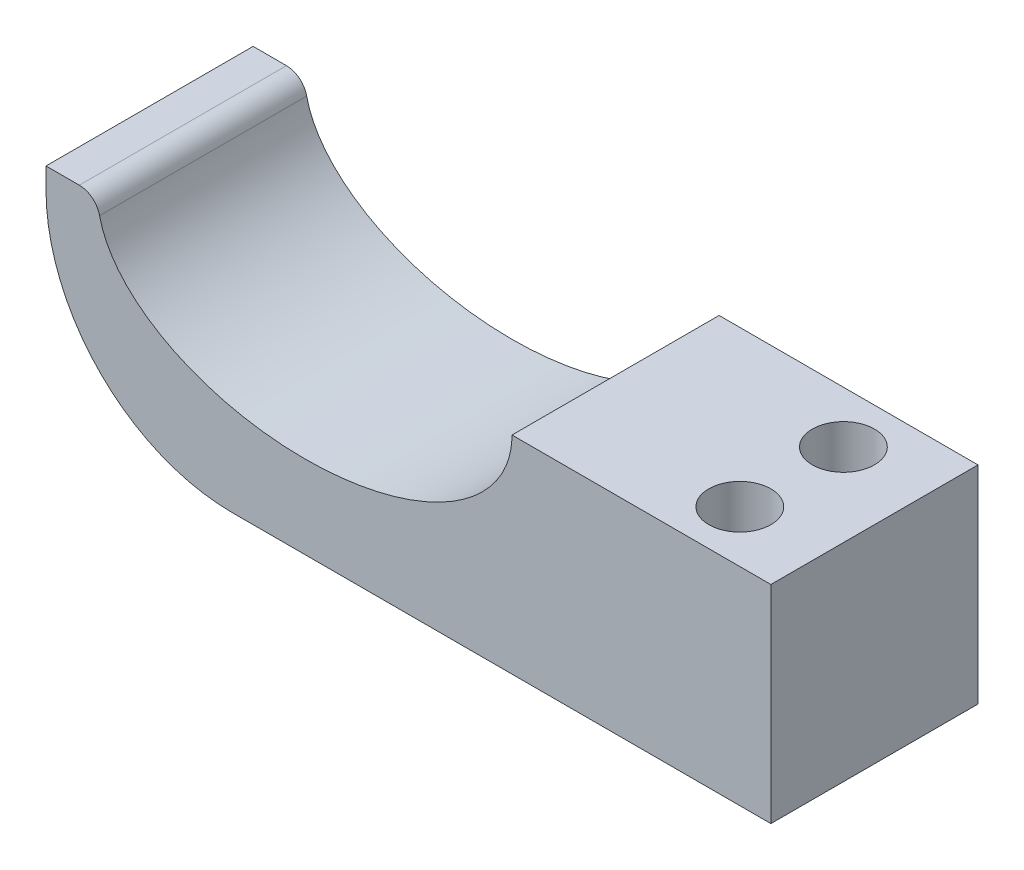
ISO-10303-21;
HEADER;
FILE_DESCRIPTION(('STEP AP214'),'2;1');
FILE_NAME('part.step','',(''),(''),'','','');
FILE_SCHEMA(('AUTOMOTIVE_DESIGN { 1 0 10303 214 1 1 1 1 }'));
ENDSEC;
DATA;
#1=APPLICATION_CONTEXT('core data for automotive mechanical design processes');
#2=APPLICATION_PROTOCOL_DEFINITION('international standard','automotive_design',2000,#1);
#3=PRODUCT_CONTEXT('',#1,'mechanical');
#4=PRODUCT('Part','Part','',(#3));
#5=PRODUCT_RELATED_PRODUCT_CATEGORY('part','',(#4));
#6=PRODUCT_DEFINITION_FORMATION('','',#4);
#7=PRODUCT_DEFINITION_CONTEXT('part definition',#1,'design');
#8=PRODUCT_DEFINITION('design','',#6,#7);
#9=PRODUCT_DEFINITION_SHAPE('','',#8);
#10=(LENGTH_UNIT() NAMED_UNIT(*) SI_UNIT(.MILLI.,.METRE.));
#11=(NAMED_UNIT(*) PLANE_ANGLE_UNIT() SI_UNIT($,.RADIAN.));
#12=(NAMED_UNIT(*) SI_UNIT($,.STERADIAN.) SOLID_ANGLE_UNIT());
#13=UNCERTAINTY_MEASURE_WITH_UNIT(LENGTH_MEASURE(1.E-05),#10,'distance_accuracy_value','');
#14=(GEOMETRIC_REPRESENTATION_CONTEXT(3) GLOBAL_UNCERTAINTY_ASSIGNED_CONTEXT((#13)) GLOBAL_UNIT_ASSIGNED_CONTEXT((#10,
#11,#12)) REPRESENTATION_CONTEXT('',''));
#15=CARTESIAN_POINT('',(0.,0.,0.));
#16=DIRECTION('',(0.,0.,1.));
#17=DIRECTION('',(1.,0.,0.));
#18=AXIS2_PLACEMENT_3D('',#15,#16,#17);
#19=CARTESIAN_POINT('',(0.,25.4,0.));
#20=DIRECTION('',(0.,1.,0.));
#21=DIRECTION('',(0.,0.,1.));
#22=AXIS2_PLACEMENT_3D('',#19,#20,#21);
#23=PLANE('',#22);
#24=DIRECTION('',(1.,0.,0.));
#25=VECTOR('',#24,1.);
#26=CARTESIAN_POINT('',(-44.45,25.4,12.7));
#27=LINE('',#26,#25);
#28=CARTESIAN_POINT('',(-44.45,25.4,12.7));
#29=VERTEX_POINT('',#28);
#30=CARTESIAN_POINT('',(-40.362270899556,25.4,12.7));
#31=VERTEX_POINT('',#30);
#32=EDGE_CURVE('E136',#29,#31,#27,.T.);
#33=ORIENTED_EDGE('',*,*,#32,.T.);
#34=DIRECTION('',(0.,0.,-1.));
#35=VECTOR('',#34,1.);
#36=CARTESIAN_POINT('',(-40.362270899556,25.4,-12.7));
#37=LINE('',#36,#35);
#38=CARTESIAN_POINT('',(-40.362270899556,25.4,-12.7));
#39=VERTEX_POINT('',#38);
#40=EDGE_CURVE('E157',#31,#39,#37,.T.);
#41=ORIENTED_EDGE('',*,*,#40,.T.);
#42=DIRECTION('',(-1.,0.,0.));
#43=VECTOR('',#42,1.);
#44=CARTESIAN_POINT('',(-44.45,25.4,-12.7));
#45=LINE('',#44,#43);
#46=CARTESIAN_POINT('',(-44.45,25.4,-12.7));
#47=VERTEX_POINT('',#46);
#48=EDGE_CURVE('E129',#39,#47,#45,.T.);
#49=ORIENTED_EDGE('',*,*,#48,.T.);
#50=DIRECTION('',(0.,0.,1.));
#51=VECTOR('',#50,1.);
#52=CARTESIAN_POINT('',(-44.45,25.4,-12.7));
#53=LINE('',#52,#51);
#54=EDGE_CURVE('E128',#47,#29,#53,.T.);
#55=ORIENTED_EDGE('',*,*,#54,.T.);
#56=EDGE_LOOP('',(#33,#41,#49,#55));
#57=FACE_BOUND('',#56,.T.);
#58=ADVANCED_FACE('F37',(#57),#23,.T.);
#59=CARTESIAN_POINT('',(44.45,25.4,-12.7));
#60=DIRECTION('',(-1.,0.,0.));
#61=DIRECTION('',(0.,0.,1.));
#62=AXIS2_PLACEMENT_3D('',#59,#60,#61);
#63=PLANE('',#62);
#64=DIRECTION('',(0.,0.,-1.));
#65=VECTOR('',#64,1.);
#66=CARTESIAN_POINT('',(44.45,0.,-12.7));
#67=LINE('',#66,#65);
#68=CARTESIAN_POINT('',(44.45,0.,12.7));
#69=VERTEX_POINT('',#68);
#70=CARTESIAN_POINT('',(44.45,0.,-12.7));
#71=VERTEX_POINT('',#70);
#72=EDGE_CURVE('E112',#69,#71,#67,.T.);
#73=ORIENTED_EDGE('',*,*,#72,.T.);
#74=DIRECTION('',(0.,-1.,0.));
#75=VECTOR('',#74,1.);
#76=CARTESIAN_POINT('',(44.45,25.4,-12.7));
#77=LINE('',#76,#75);
#78=CARTESIAN_POINT('',(44.45,25.4,-12.7));
#79=VERTEX_POINT('',#78);
#80=EDGE_CURVE('E122',#79,#71,#77,.T.);
#81=ORIENTED_EDGE('',*,*,#80,.F.);
#82=DIRECTION('',(0.,0.,-1.));
#83=VECTOR('',#82,1.);
#84=CARTESIAN_POINT('',(44.45,25.4,-12.7));
#85=LINE('',#84,#83);
#86=CARTESIAN_POINT('',(44.45,25.4,12.7));
#87=VERTEX_POINT('',#86);
#88=EDGE_CURVE('E126',#87,#79,#85,.T.);
#89=ORIENTED_EDGE('',*,*,#88,.F.);
#90=DIRECTION('',(0.,-1.,0.));
#91=VECTOR('',#90,1.);
#92=CARTESIAN_POINT('',(44.45,25.4,12.7));
#93=LINE('',#92,#91);
#94=EDGE_CURVE('E139',#87,#69,#93,.T.);
#95=ORIENTED_EDGE('',*,*,#94,.T.);
#96=EDGE_LOOP('',(#73,#81,#89,#95));
#97=FACE_BOUND('',#96,.T.);
#98=ADVANCED_FACE('F205',(#97),#63,.F.);
#99=CARTESIAN_POINT('',(-44.45,25.4,-12.7));
#100=DIRECTION('',(0.,0.,1.));
#101=DIRECTION('',(1.,0.,0.));
#102=AXIS2_PLACEMENT_3D('',#99,#100,#101);
#103=PLANE('',#102);
#104=DIRECTION('',(-1.,0.,0.));
#105=VECTOR('',#104,1.);
#106=CARTESIAN_POINT('',(-44.45,0.,-12.7));
#107=LINE('',#106,#105);
#108=CARTESIAN_POINT('',(-21.59,0.,-12.7));
#109=VERTEX_POINT('',#108);
#110=EDGE_CURVE('E142',#71,#109,#107,.T.);
#111=ORIENTED_EDGE('',*,*,#110,.T.);
#112=CARTESIAN_POINT('',(-21.59,22.86,-12.7));
#113=DIRECTION('',(0.,0.,1.));
#114=DIRECTION('',(1.,0.,0.));
#115=AXIS2_PLACEMENT_3D('',#112,#113,#114);
#116=CIRCLE('',#115,22.86);
#117=CARTESIAN_POINT('',(-44.45,22.86,-12.7));
#118=VERTEX_POINT('',#117);
#119=EDGE_CURVE('E11',#109,#118,#116,.F.);
#120=ORIENTED_EDGE('',*,*,#119,.T.);
#121=DIRECTION('',(0.,-1.,0.));
#122=VECTOR('',#121,1.);
#123=CARTESIAN_POINT('',(-44.45,25.4,-12.7));
#124=LINE('',#123,#122);
#125=EDGE_CURVE('E150',#47,#118,#124,.T.);
#126=ORIENTED_EDGE('',*,*,#125,.F.);
#127=ORIENTED_EDGE('',*,*,#48,.F.);
#128=CARTESIAN_POINT('',(-40.362270899556,22.86,-12.7));
#129=DIRECTION('',(0.,0.,1.));
#130=DIRECTION('',(1.,0.,0.));
#131=AXIS2_PLACEMENT_3D('',#128,#129,#130);
#132=CIRCLE('',#131,2.54);
#133=CARTESIAN_POINT('',(-37.8815880027146,23.4057218754259,-12.7));
#134=VERTEX_POINT('',#133);
#135=EDGE_CURVE('E108',#39,#134,#132,.F.);
#136=ORIENTED_EDGE('',*,*,#135,.T.);
#137=CARTESIAN_POINT('',(-12.7,25.4,-12.7));
#138=DIRECTION('',(0.,0.,1.));
#139=DIRECTION('',(-1.,0.,0.));
#140=AXIS2_PLACEMENT_3D('',#137,#138,#139);
#141=ELLIPSE('',#140,25.4,15.24);
#142=CARTESIAN_POINT('',(12.7,25.4,-12.7));
#143=VERTEX_POINT('',#142);
#144=EDGE_CURVE('E99',#134,#143,#141,.T.);
#145=ORIENTED_EDGE('',*,*,#144,.T.);
#146=EDGE_CURVE('E104',#79,#143,#45,.T.);
#147=ORIENTED_EDGE('',*,*,#146,.F.);
#148=ORIENTED_EDGE('',*,*,#80,.T.);
#149=EDGE_LOOP('',(#111,#120,#126,#127,#136,#145,#147,#148));
#150=FACE_BOUND('',#149,.T.);
#151=ADVANCED_FACE('F101',(#150),#103,.F.);
#152=CARTESIAN_POINT('',(-44.45,25.4,-12.7));
#153=DIRECTION('',(1.,0.,0.));
#154=DIRECTION('',(0.,0.,-1.));
#155=AXIS2_PLACEMENT_3D('',#152,#153,#154);
#156=PLANE('',#155);
#157=ORIENTED_EDGE('',*,*,#125,.T.);
#158=DIRECTION('',(0.,0.,1.));
#159=VECTOR('',#158,1.);
#160=CARTESIAN_POINT('',(-44.45,22.86,-12.7));
#161=LINE('',#160,#159);
#162=CARTESIAN_POINT('',(-44.45,22.86,12.7));
#163=VERTEX_POINT('',#162);
#164=EDGE_CURVE('E160',#118,#163,#161,.T.);
#165=ORIENTED_EDGE('',*,*,#164,.T.);
#166=DIRECTION('',(0.,-1.,0.));
#167=VECTOR('',#166,1.);
#168=CARTESIAN_POINT('',(-44.45,25.4,12.7));
#169=LINE('',#168,#167);
#170=EDGE_CURVE('E148',#29,#163,#169,.T.);
#171=ORIENTED_EDGE('',*,*,#170,.F.);
#172=ORIENTED_EDGE('',*,*,#54,.F.);
#173=EDGE_LOOP('',(#157,#165,#171,#172));
#174=FACE_BOUND('',#173,.T.);
#175=ADVANCED_FACE('F166',(#174),#156,.F.);
#176=CARTESIAN_POINT('',(-44.45,25.4,12.7));
#177=DIRECTION('',(0.,0.,-1.));
#178=DIRECTION('',(-1.,0.,0.));
#179=AXIS2_PLACEMENT_3D('',#176,#177,#178);
#180=PLANE('',#179);
#181=ORIENTED_EDGE('',*,*,#170,.T.);
#182=CARTESIAN_POINT('',(-21.59,22.86,12.7));
#183=DIRECTION('',(0.,0.,-1.));
#184=DIRECTION('',(-1.,0.,0.));
#185=AXIS2_PLACEMENT_3D('',#182,#183,#184);
#186=CIRCLE('',#185,22.86);
#187=CARTESIAN_POINT('',(-21.59,0.,12.7));
#188=VERTEX_POINT('',#187);
#189=EDGE_CURVE('E59',#163,#188,#186,.F.);
#190=ORIENTED_EDGE('',*,*,#189,.T.);
#191=DIRECTION('',(1.,0.,0.));
#192=VECTOR('',#191,1.);
#193=CARTESIAN_POINT('',(-44.45,0.,12.7));
#194=LINE('',#193,#192);
#195=EDGE_CURVE('E144',#188,#69,#194,.T.);
#196=ORIENTED_EDGE('',*,*,#195,.T.);
#197=ORIENTED_EDGE('',*,*,#94,.F.);
#198=CARTESIAN_POINT('',(12.7,25.4,12.7));
#199=VERTEX_POINT('',#198);
#200=EDGE_CURVE('E131',#199,#87,#27,.T.);
#201=ORIENTED_EDGE('',*,*,#200,.F.);
#202=CARTESIAN_POINT('',(-12.7,25.4,12.7));
#203=DIRECTION('',(0.,0.,1.));
#204=DIRECTION('',(-1.,0.,0.));
#205=AXIS2_PLACEMENT_3D('',#202,#203,#204);
#206=ELLIPSE('',#205,25.4,15.24);
#207=CARTESIAN_POINT('',(-37.8815880027146,23.4057218754259,12.7));
#208=VERTEX_POINT('',#207);
#209=EDGE_CURVE('E113',#208,#199,#206,.T.);
#210=ORIENTED_EDGE('',*,*,#209,.F.);
#211=CARTESIAN_POINT('',(-40.362270899556,22.86,12.7));
#212=DIRECTION('',(0.,0.,-1.));
#213=DIRECTION('',(-1.,0.,0.));
#214=AXIS2_PLACEMENT_3D('',#211,#212,#213);
#215=CIRCLE('',#214,2.54);
#216=EDGE_CURVE('E155',#208,#31,#215,.F.);
#217=ORIENTED_EDGE('',*,*,#216,.T.);
#218=ORIENTED_EDGE('',*,*,#32,.F.);
#219=EDGE_LOOP('',(#181,#190,#196,#197,#201,#210,#217,#218));
#220=FACE_BOUND('',#219,.T.);
#221=ADVANCED_FACE('F172',(#220),#180,.F.);
#222=CARTESIAN_POINT('',(34.29,25.4,-6.35));
#223=DIRECTION('',(0.,1.,0.));
#224=DIRECTION('',(0.,0.,1.));
#225=AXIS2_PLACEMENT_3D('',#222,#223,#224);
#226=CIRCLE('',#225,3.81);
#227=CARTESIAN_POINT('',(34.29,25.4,-2.54));
#228=VERTEX_POINT('',#227);
#229=EDGE_CURVE('E180',#228,#228,#226,.T.);
#230=ORIENTED_EDGE('',*,*,#229,.F.);
#231=EDGE_LOOP('',(#230));
#232=FACE_BOUND('',#231,.T.);
#233=CARTESIAN_POINT('',(34.29,25.4,6.35));
#234=DIRECTION('',(0.,1.,0.));
#235=DIRECTION('',(0.,0.,1.));
#236=AXIS2_PLACEMENT_3D('',#233,#234,#235);
#237=CIRCLE('',#236,3.81);
#238=CARTESIAN_POINT('',(34.29,25.4,10.16));
#239=VERTEX_POINT('',#238);
#240=EDGE_CURVE('E304',#239,#239,#237,.T.);
#241=ORIENTED_EDGE('',*,*,#240,.F.);
#242=EDGE_LOOP('',(#241));
#243=FACE_BOUND('',#242,.T.);
#244=DIRECTION('',(0.,0.,1.));
#245=VECTOR('',#244,1.);
#246=CARTESIAN_POINT('',(12.7,25.4,-12.7));
#247=LINE('',#246,#245);
#248=EDGE_CURVE('E116',#199,#143,#247,.F.);
#249=ORIENTED_EDGE('',*,*,#248,.F.);
#250=ORIENTED_EDGE('',*,*,#200,.T.);
#251=ORIENTED_EDGE('',*,*,#88,.T.);
#252=ORIENTED_EDGE('',*,*,#146,.T.);
#253=EDGE_LOOP('',(#249,#250,#251,#252));
#254=FACE_BOUND('',#253,.T.);
#255=ADVANCED_FACE('F124',(#232,#243,#254),#23,.T.);
#256=CARTESIAN_POINT('',(0.,0.,0.));
#257=DIRECTION('',(0.,1.,0.));
#258=DIRECTION('',(0.,0.,1.));
#259=AXIS2_PLACEMENT_3D('',#256,#257,#258);
#260=PLANE('',#259);
#261=CARTESIAN_POINT('',(34.29,0.,-6.35));
#262=DIRECTION('',(0.,1.,0.));
#263=DIRECTION('',(0.,0.,1.));
#264=AXIS2_PLACEMENT_3D('',#261,#262,#263);
#265=CIRCLE('',#264,3.81);
#266=CARTESIAN_POINT('',(34.29,0.,-2.54));
#267=VERTEX_POINT('',#266);
#268=EDGE_CURVE('E178',#267,#267,#265,.T.);
#269=ORIENTED_EDGE('',*,*,#268,.T.);
#270=EDGE_LOOP('',(#269));
#271=FACE_BOUND('',#270,.T.);
#272=CARTESIAN_POINT('',(34.29,0.,6.35));
#273=DIRECTION('',(0.,1.,0.));
#274=DIRECTION('',(0.,0.,1.));
#275=AXIS2_PLACEMENT_3D('',#272,#273,#274);
#276=CIRCLE('',#275,3.81);
#277=CARTESIAN_POINT('',(34.29,0.,10.16));
#278=VERTEX_POINT('',#277);
#279=EDGE_CURVE('E184',#278,#278,#276,.T.);
#280=ORIENTED_EDGE('',*,*,#279,.T.);
#281=EDGE_LOOP('',(#280));
#282=FACE_BOUND('',#281,.T.);
#283=ORIENTED_EDGE('',*,*,#195,.F.);
#284=DIRECTION('',(0.,0.,1.));
#285=VECTOR('',#284,1.);
#286=CARTESIAN_POINT('',(-21.59,0.,0.));
#287=LINE('',#286,#285);
#288=EDGE_CURVE('E45',#188,#109,#287,.F.);
#289=ORIENTED_EDGE('',*,*,#288,.T.);
#290=ORIENTED_EDGE('',*,*,#110,.F.);
#291=ORIENTED_EDGE('',*,*,#72,.F.);
#292=EDGE_LOOP('',(#283,#289,#290,#291));
#293=FACE_BOUND('',#292,.T.);
#294=ADVANCED_FACE('F190',(#271,#282,#293),#260,.F.);
#295=DIRECTION('',(0.,0.,1.));
#296=VECTOR('',#295,1.);
#297=SURFACE_OF_LINEAR_EXTRUSION('',#141,#296);
#298=ORIENTED_EDGE('',*,*,#144,.F.);
#299=DIRECTION('',(0.,0.,1.));
#300=VECTOR('',#299,1.);
#301=CARTESIAN_POINT('',(-37.8815880027146,23.4057218754259,-12.7));
#302=LINE('',#301,#300);
#303=EDGE_CURVE('E121',#134,#208,#302,.T.);
#304=ORIENTED_EDGE('',*,*,#303,.T.);
#305=ORIENTED_EDGE('',*,*,#209,.T.);
#306=ORIENTED_EDGE('',*,*,#248,.T.);
#307=EDGE_LOOP('',(#298,#304,#305,#306));
#308=FACE_BOUND('',#307,.T.);
#309=ADVANCED_FACE('F117',(#308),#297,.F.);
#310=CARTESIAN_POINT('',(-40.362270899556,22.86,0.));
#311=DIRECTION('',(0.,0.,1.));
#312=DIRECTION('',(1.,0.,0.));
#313=AXIS2_PLACEMENT_3D('',#310,#311,#312);
#314=CYLINDRICAL_SURFACE('',#313,2.54);
#315=ORIENTED_EDGE('',*,*,#135,.F.);
#316=ORIENTED_EDGE('',*,*,#40,.F.);
#317=ORIENTED_EDGE('',*,*,#216,.F.);
#318=ORIENTED_EDGE('',*,*,#303,.F.);
#319=EDGE_LOOP('',(#315,#316,#317,#318));
#320=FACE_BOUND('',#319,.T.);
#321=ADVANCED_FACE('F176',(#320),#314,.T.);
#322=CARTESIAN_POINT('',(34.29,0.,6.35));
#323=DIRECTION('',(0.,1.,0.));
#324=DIRECTION('',(0.,0.,1.));
#325=AXIS2_PLACEMENT_3D('',#322,#323,#324);
#326=CYLINDRICAL_SURFACE('',#325,3.81);
#327=ORIENTED_EDGE('',*,*,#279,.F.);
#328=EDGE_LOOP('',(#327));
#329=FACE_BOUND('',#328,.T.);
#330=ORIENTED_EDGE('',*,*,#240,.T.);
#331=EDGE_LOOP('',(#330));
#332=FACE_BOUND('',#331,.T.);
#333=ADVANCED_FACE('F191',(#329,#332),#326,.F.);
#334=CARTESIAN_POINT('',(34.29,0.,-6.35));
#335=DIRECTION('',(0.,1.,0.));
#336=DIRECTION('',(0.,0.,1.));
#337=AXIS2_PLACEMENT_3D('',#334,#335,#336);
#338=CYLINDRICAL_SURFACE('',#337,3.81);
#339=ORIENTED_EDGE('',*,*,#268,.F.);
#340=EDGE_LOOP('',(#339));
#341=FACE_BOUND('',#340,.T.);
#342=ORIENTED_EDGE('',*,*,#229,.T.);
#343=EDGE_LOOP('',(#342));
#344=FACE_BOUND('',#343,.T.);
#345=ADVANCED_FACE('F212',(#341,#344),#338,.F.);
#346=CARTESIAN_POINT('',(-21.59,22.86,-12.7));
#347=DIRECTION('',(0.,0.,1.));
#348=DIRECTION('',(1.,0.,0.));
#349=AXIS2_PLACEMENT_3D('',#346,#347,#348);
#350=CYLINDRICAL_SURFACE('',#349,22.86);
#351=ORIENTED_EDGE('',*,*,#119,.F.);
#352=ORIENTED_EDGE('',*,*,#288,.F.);
#353=ORIENTED_EDGE('',*,*,#189,.F.);
#354=ORIENTED_EDGE('',*,*,#164,.F.);
#355=EDGE_LOOP('',(#351,#352,#353,#354));
#356=FACE_BOUND('',#355,.T.);
#357=ADVANCED_FACE('F39',(#356),#350,.T.);
#358=CLOSED_SHELL('',(#58,#98,#151,#175,#221,#255,#294,#309,#321,#333,#345,#357));
#359=MANIFOLD_SOLID_BREP('B2',#358);
#360=ADVANCED_BREP_SHAPE_REPRESENTATION('',(#18,#359),#14);
#361=SHAPE_DEFINITION_REPRESENTATION(#9,#360);
ENDSEC;
END-ISO-10303-21;
